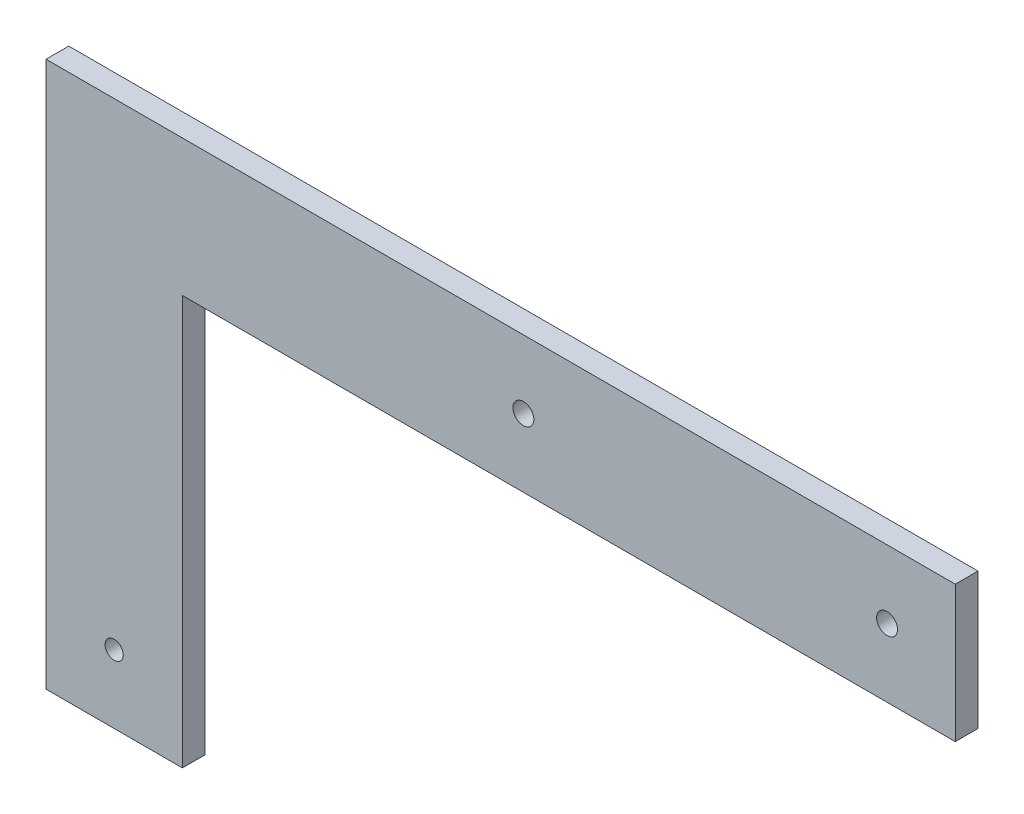
ISO-10303-21;
HEADER;
FILE_DESCRIPTION(('STEP AP214'),'2;1');
FILE_NAME('part.step','',(''),(''),'','','');
FILE_SCHEMA(('AUTOMOTIVE_DESIGN { 1 0 10303 214 1 1 1 1 }'));
ENDSEC;
DATA;
#1=APPLICATION_CONTEXT('core data for automotive mechanical design processes');
#2=APPLICATION_PROTOCOL_DEFINITION('international standard','automotive_design',2000,#1);
#3=PRODUCT_CONTEXT('',#1,'mechanical');
#4=PRODUCT('Part','Part','',(#3));
#5=PRODUCT_RELATED_PRODUCT_CATEGORY('part','',(#4));
#6=PRODUCT_DEFINITION_FORMATION('','',#4);
#7=PRODUCT_DEFINITION_CONTEXT('part definition',#1,'design');
#8=PRODUCT_DEFINITION('design','',#6,#7);
#9=PRODUCT_DEFINITION_SHAPE('','',#8);
#10=(LENGTH_UNIT() NAMED_UNIT(*) SI_UNIT(.MILLI.,.METRE.));
#11=(NAMED_UNIT(*) PLANE_ANGLE_UNIT() SI_UNIT($,.RADIAN.));
#12=(NAMED_UNIT(*) SI_UNIT($,.STERADIAN.) SOLID_ANGLE_UNIT());
#13=UNCERTAINTY_MEASURE_WITH_UNIT(LENGTH_MEASURE(1.E-05),#10,'distance_accuracy_value','');
#14=(GEOMETRIC_REPRESENTATION_CONTEXT(3) GLOBAL_UNCERTAINTY_ASSIGNED_CONTEXT((#13)) GLOBAL_UNIT_ASSIGNED_CONTEXT((#10,
#11,#12)) REPRESENTATION_CONTEXT('',''));
#15=CARTESIAN_POINT('',(0.,0.,0.));
#16=DIRECTION('',(0.,0.,1.));
#17=DIRECTION('',(1.,0.,0.));
#18=AXIS2_PLACEMENT_3D('',#15,#16,#17);
#19=CARTESIAN_POINT('',(19.05,0.,3.175));
#20=DIRECTION('',(0.,1.,0.));
#21=DIRECTION('',(-1.,0.,0.));
#22=AXIS2_PLACEMENT_3D('',#19,#20,#21);
#23=PLANE('',#22);
#24=DIRECTION('',(1.,0.,0.));
#25=VECTOR('',#24,1.);
#26=CARTESIAN_POINT('',(19.05,0.,0.));
#27=LINE('',#26,#25);
#28=CARTESIAN_POINT('',(0.,0.,0.));
#29=VERTEX_POINT('',#28);
#30=CARTESIAN_POINT('',(19.05,0.,0.));
#31=VERTEX_POINT('',#30);
#32=EDGE_CURVE('E133',#29,#31,#27,.T.);
#33=ORIENTED_EDGE('',*,*,#32,.T.);
#34=DIRECTION('',(0.,0.,-1.));
#35=VECTOR('',#34,1.);
#36=CARTESIAN_POINT('',(19.05,0.,3.175));
#37=LINE('',#36,#35);
#38=CARTESIAN_POINT('',(19.05,0.,3.175));
#39=VERTEX_POINT('',#38);
#40=EDGE_CURVE('E11',#39,#31,#37,.T.);
#41=ORIENTED_EDGE('',*,*,#40,.F.);
#42=DIRECTION('',(1.,0.,0.));
#43=VECTOR('',#42,1.);
#44=CARTESIAN_POINT('',(19.05,0.,3.175));
#45=LINE('',#44,#43);
#46=CARTESIAN_POINT('',(0.,0.,3.175));
#47=VERTEX_POINT('',#46);
#48=EDGE_CURVE('E150',#47,#39,#45,.T.);
#49=ORIENTED_EDGE('',*,*,#48,.F.);
#50=DIRECTION('',(0.,0.,-1.));
#51=VECTOR('',#50,1.);
#52=CARTESIAN_POINT('',(0.,0.,3.175));
#53=LINE('',#52,#51);
#54=EDGE_CURVE('E129',#47,#29,#53,.T.);
#55=ORIENTED_EDGE('',*,*,#54,.T.);
#56=EDGE_LOOP('',(#33,#41,#49,#55));
#57=FACE_BOUND('',#56,.T.);
#58=ADVANCED_FACE('F44',(#57),#23,.F.);
#59=CARTESIAN_POINT('',(19.05,57.15,3.175));
#60=DIRECTION('',(-1.,0.,0.));
#61=DIRECTION('',(0.,-1.,0.));
#62=AXIS2_PLACEMENT_3D('',#59,#60,#61);
#63=PLANE('',#62);
#64=DIRECTION('',(0.,1.,0.));
#65=VECTOR('',#64,1.);
#66=CARTESIAN_POINT('',(19.05,57.15,0.));
#67=LINE('',#66,#65);
#68=CARTESIAN_POINT('',(19.05,57.15,0.));
#69=VERTEX_POINT('',#68);
#70=EDGE_CURVE('E137',#31,#69,#67,.T.);
#71=ORIENTED_EDGE('',*,*,#70,.T.);
#72=DIRECTION('',(0.,0.,-1.));
#73=VECTOR('',#72,1.);
#74=CARTESIAN_POINT('',(19.05,57.15,3.175));
#75=LINE('',#74,#73);
#76=CARTESIAN_POINT('',(19.05,57.15,3.175));
#77=VERTEX_POINT('',#76);
#78=EDGE_CURVE('E53',#77,#69,#75,.T.);
#79=ORIENTED_EDGE('',*,*,#78,.F.);
#80=DIRECTION('',(0.,1.,0.));
#81=VECTOR('',#80,1.);
#82=CARTESIAN_POINT('',(19.05,57.15,3.175));
#83=LINE('',#82,#81);
#84=EDGE_CURVE('E98',#39,#77,#83,.T.);
#85=ORIENTED_EDGE('',*,*,#84,.F.);
#86=ORIENTED_EDGE('',*,*,#40,.T.);
#87=EDGE_LOOP('',(#71,#79,#85,#86));
#88=FACE_BOUND('',#87,.T.);
#89=ADVANCED_FACE('F179',(#88),#63,.F.);
#90=CARTESIAN_POINT('',(127.,57.15,3.175));
#91=DIRECTION('',(0.,1.,0.));
#92=DIRECTION('',(-1.,0.,0.));
#93=AXIS2_PLACEMENT_3D('',#90,#91,#92);
#94=PLANE('',#93);
#95=DIRECTION('',(1.,0.,0.));
#96=VECTOR('',#95,1.);
#97=CARTESIAN_POINT('',(127.,57.15,0.));
#98=LINE('',#97,#96);
#99=CARTESIAN_POINT('',(127.,57.15,0.));
#100=VERTEX_POINT('',#99);
#101=EDGE_CURVE('E141',#69,#100,#98,.T.);
#102=ORIENTED_EDGE('',*,*,#101,.T.);
#103=DIRECTION('',(0.,0.,-1.));
#104=VECTOR('',#103,1.);
#105=CARTESIAN_POINT('',(127.,57.15,3.175));
#106=LINE('',#105,#104);
#107=CARTESIAN_POINT('',(127.,57.15,3.175));
#108=VERTEX_POINT('',#107);
#109=EDGE_CURVE('E122',#108,#100,#106,.T.);
#110=ORIENTED_EDGE('',*,*,#109,.F.);
#111=DIRECTION('',(1.,0.,0.));
#112=VECTOR('',#111,1.);
#113=CARTESIAN_POINT('',(127.,57.15,3.175));
#114=LINE('',#113,#112);
#115=EDGE_CURVE('E111',#77,#108,#114,.T.);
#116=ORIENTED_EDGE('',*,*,#115,.F.);
#117=ORIENTED_EDGE('',*,*,#78,.T.);
#118=EDGE_LOOP('',(#102,#110,#116,#117));
#119=FACE_BOUND('',#118,.T.);
#120=ADVANCED_FACE('F160',(#119),#94,.F.);
#121=CARTESIAN_POINT('',(127.,76.2,3.175));
#122=DIRECTION('',(-1.,0.,0.));
#123=DIRECTION('',(0.,0.,1.));
#124=AXIS2_PLACEMENT_3D('',#121,#122,#123);
#125=PLANE('',#124);
#126=DIRECTION('',(0.,1.,0.));
#127=VECTOR('',#126,1.);
#128=CARTESIAN_POINT('',(127.,76.2,0.));
#129=LINE('',#128,#127);
#130=CARTESIAN_POINT('',(127.,76.2,0.));
#131=VERTEX_POINT('',#130);
#132=EDGE_CURVE('E120',#100,#131,#129,.T.);
#133=ORIENTED_EDGE('',*,*,#132,.T.);
#134=DIRECTION('',(0.,0.,-1.));
#135=VECTOR('',#134,1.);
#136=CARTESIAN_POINT('',(127.,76.2,3.175));
#137=LINE('',#136,#135);
#138=CARTESIAN_POINT('',(127.,76.2,3.175));
#139=VERTEX_POINT('',#138);
#140=EDGE_CURVE('E117',#139,#131,#137,.T.);
#141=ORIENTED_EDGE('',*,*,#140,.F.);
#142=DIRECTION('',(0.,1.,0.));
#143=VECTOR('',#142,1.);
#144=CARTESIAN_POINT('',(127.,76.2,3.175));
#145=LINE('',#144,#143);
#146=EDGE_CURVE('E105',#108,#139,#145,.T.);
#147=ORIENTED_EDGE('',*,*,#146,.F.);
#148=ORIENTED_EDGE('',*,*,#109,.T.);
#149=EDGE_LOOP('',(#133,#141,#147,#148));
#150=FACE_BOUND('',#149,.T.);
#151=ADVANCED_FACE('F118',(#150),#125,.F.);
#152=CARTESIAN_POINT('',(0.,76.2,3.175));
#153=DIRECTION('',(0.,-1.,0.));
#154=DIRECTION('',(0.,0.,-1.));
#155=AXIS2_PLACEMENT_3D('',#152,#153,#154);
#156=PLANE('',#155);
#157=DIRECTION('',(-1.,0.,0.));
#158=VECTOR('',#157,1.);
#159=CARTESIAN_POINT('',(0.,76.2,0.));
#160=LINE('',#159,#158);
#161=CARTESIAN_POINT('',(0.,76.2,0.));
#162=VERTEX_POINT('',#161);
#163=EDGE_CURVE('E84',#131,#162,#160,.T.);
#164=ORIENTED_EDGE('',*,*,#163,.T.);
#165=DIRECTION('',(0.,0.,-1.));
#166=VECTOR('',#165,1.);
#167=CARTESIAN_POINT('',(0.,76.2,3.175));
#168=LINE('',#167,#166);
#169=CARTESIAN_POINT('',(0.,76.2,3.175));
#170=VERTEX_POINT('',#169);
#171=EDGE_CURVE('E123',#170,#162,#168,.T.);
#172=ORIENTED_EDGE('',*,*,#171,.F.);
#173=DIRECTION('',(-1.,0.,0.));
#174=VECTOR('',#173,1.);
#175=CARTESIAN_POINT('',(0.,76.2,3.175));
#176=LINE('',#175,#174);
#177=EDGE_CURVE('E109',#139,#170,#176,.T.);
#178=ORIENTED_EDGE('',*,*,#177,.F.);
#179=ORIENTED_EDGE('',*,*,#140,.T.);
#180=EDGE_LOOP('',(#164,#172,#178,#179));
#181=FACE_BOUND('',#180,.T.);
#182=ADVANCED_FACE('F125',(#181),#156,.F.);
#183=CARTESIAN_POINT('',(0.,0.,3.175));
#184=DIRECTION('',(1.,0.,0.));
#185=DIRECTION('',(0.,0.,-1.));
#186=AXIS2_PLACEMENT_3D('',#183,#184,#185);
#187=PLANE('',#186);
#188=DIRECTION('',(0.,-1.,0.));
#189=VECTOR('',#188,1.);
#190=CARTESIAN_POINT('',(0.,0.,0.));
#191=LINE('',#190,#189);
#192=EDGE_CURVE('E90',#162,#29,#191,.T.);
#193=ORIENTED_EDGE('',*,*,#192,.T.);
#194=ORIENTED_EDGE('',*,*,#54,.F.);
#195=DIRECTION('',(0.,-1.,0.));
#196=VECTOR('',#195,1.);
#197=CARTESIAN_POINT('',(0.,0.,3.175));
#198=LINE('',#197,#196);
#199=EDGE_CURVE('E61',#170,#47,#198,.T.);
#200=ORIENTED_EDGE('',*,*,#199,.F.);
#201=ORIENTED_EDGE('',*,*,#171,.T.);
#202=EDGE_LOOP('',(#193,#194,#200,#201));
#203=FACE_BOUND('',#202,.T.);
#204=ADVANCED_FACE('F167',(#203),#187,.F.);
#205=CARTESIAN_POINT('',(0.,0.,3.175));
#206=DIRECTION('',(0.,0.,-1.));
#207=DIRECTION('',(-1.,0.,0.));
#208=AXIS2_PLACEMENT_3D('',#205,#206,#207);
#209=PLANE('',#208);
#210=CARTESIAN_POINT('',(9.525,9.525,3.175));
#211=DIRECTION('',(0.,0.,1.));
#212=DIRECTION('',(1.,0.,0.));
#213=AXIS2_PLACEMENT_3D('',#210,#211,#212);
#214=CIRCLE('',#213,1.27);
#215=CARTESIAN_POINT('',(10.795,9.525,3.175));
#216=VERTEX_POINT('',#215);
#217=EDGE_CURVE('E290',#216,#216,#214,.T.);
#218=ORIENTED_EDGE('',*,*,#217,.F.);
#219=EDGE_LOOP('',(#218));
#220=FACE_BOUND('',#219,.T.);
#221=CARTESIAN_POINT('',(117.475,66.675,3.175));
#222=DIRECTION('',(0.,0.,1.));
#223=DIRECTION('',(1.,0.,0.));
#224=AXIS2_PLACEMENT_3D('',#221,#222,#223);
#225=CIRCLE('',#224,1.4605);
#226=CARTESIAN_POINT('',(118.9355,66.675,3.175));
#227=VERTEX_POINT('',#226);
#228=EDGE_CURVE('E292',#227,#227,#225,.T.);
#229=ORIENTED_EDGE('',*,*,#228,.F.);
#230=EDGE_LOOP('',(#229));
#231=FACE_BOUND('',#230,.T.);
#232=CARTESIAN_POINT('',(66.675,66.675,3.175));
#233=DIRECTION('',(0.,0.,1.));
#234=DIRECTION('',(1.,0.,0.));
#235=AXIS2_PLACEMENT_3D('',#232,#233,#234);
#236=CIRCLE('',#235,1.4605);
#237=CARTESIAN_POINT('',(68.1355,66.675,3.175));
#238=VERTEX_POINT('',#237);
#239=EDGE_CURVE('E304',#238,#238,#236,.T.);
#240=ORIENTED_EDGE('',*,*,#239,.F.);
#241=EDGE_LOOP('',(#240));
#242=FACE_BOUND('',#241,.T.);
#243=ORIENTED_EDGE('',*,*,#48,.T.);
#244=ORIENTED_EDGE('',*,*,#84,.T.);
#245=ORIENTED_EDGE('',*,*,#115,.T.);
#246=ORIENTED_EDGE('',*,*,#146,.T.);
#247=ORIENTED_EDGE('',*,*,#177,.T.);
#248=ORIENTED_EDGE('',*,*,#199,.T.);
#249=EDGE_LOOP('',(#243,#244,#245,#246,#247,#248));
#250=FACE_BOUND('',#249,.T.);
#251=ADVANCED_FACE('F107',(#220,#231,#242,#250),#209,.F.);
#252=CARTESIAN_POINT('',(0.,0.,0.));
#253=DIRECTION('',(0.,0.,-1.));
#254=DIRECTION('',(-1.,0.,0.));
#255=AXIS2_PLACEMENT_3D('',#252,#253,#254);
#256=PLANE('',#255);
#257=CARTESIAN_POINT('',(9.525,9.525,0.));
#258=DIRECTION('',(0.,0.,1.));
#259=DIRECTION('',(1.,0.,0.));
#260=AXIS2_PLACEMENT_3D('',#257,#258,#259);
#261=CIRCLE('',#260,1.27);
#262=CARTESIAN_POINT('',(10.795,9.525,0.));
#263=VERTEX_POINT('',#262);
#264=EDGE_CURVE('E138',#263,#263,#261,.T.);
#265=ORIENTED_EDGE('',*,*,#264,.T.);
#266=EDGE_LOOP('',(#265));
#267=FACE_BOUND('',#266,.T.);
#268=CARTESIAN_POINT('',(117.475,66.675,0.));
#269=DIRECTION('',(0.,0.,1.));
#270=DIRECTION('',(1.,0.,0.));
#271=AXIS2_PLACEMENT_3D('',#268,#269,#270);
#272=CIRCLE('',#271,1.4605);
#273=CARTESIAN_POINT('',(118.9355,66.675,0.));
#274=VERTEX_POINT('',#273);
#275=EDGE_CURVE('E298',#274,#274,#272,.T.);
#276=ORIENTED_EDGE('',*,*,#275,.T.);
#277=EDGE_LOOP('',(#276));
#278=FACE_BOUND('',#277,.T.);
#279=CARTESIAN_POINT('',(66.675,66.675,0.));
#280=DIRECTION('',(0.,0.,1.));
#281=DIRECTION('',(1.,0.,0.));
#282=AXIS2_PLACEMENT_3D('',#279,#280,#281);
#283=CIRCLE('',#282,1.4605);
#284=CARTESIAN_POINT('',(68.1355,66.675,0.));
#285=VERTEX_POINT('',#284);
#286=EDGE_CURVE('E308',#285,#285,#283,.T.);
#287=ORIENTED_EDGE('',*,*,#286,.T.);
#288=EDGE_LOOP('',(#287));
#289=FACE_BOUND('',#288,.T.);
#290=ORIENTED_EDGE('',*,*,#32,.F.);
#291=ORIENTED_EDGE('',*,*,#192,.F.);
#292=ORIENTED_EDGE('',*,*,#163,.F.);
#293=ORIENTED_EDGE('',*,*,#132,.F.);
#294=ORIENTED_EDGE('',*,*,#101,.F.);
#295=ORIENTED_EDGE('',*,*,#70,.F.);
#296=EDGE_LOOP('',(#290,#291,#292,#293,#294,#295));
#297=FACE_BOUND('',#296,.T.);
#298=ADVANCED_FACE('F163',(#267,#278,#289,#297),#256,.T.);
#299=CARTESIAN_POINT('',(66.675,66.675,0.));
#300=DIRECTION('',(0.,0.,1.));
#301=DIRECTION('',(1.,0.,0.));
#302=AXIS2_PLACEMENT_3D('',#299,#300,#301);
#303=CYLINDRICAL_SURFACE('',#302,1.4605);
#304=ORIENTED_EDGE('',*,*,#286,.F.);
#305=EDGE_LOOP('',(#304));
#306=FACE_BOUND('',#305,.T.);
#307=ORIENTED_EDGE('',*,*,#239,.T.);
#308=EDGE_LOOP('',(#307));
#309=FACE_BOUND('',#308,.T.);
#310=ADVANCED_FACE('F219',(#306,#309),#303,.F.);
#311=CARTESIAN_POINT('',(117.475,66.675,0.));
#312=DIRECTION('',(0.,0.,1.));
#313=DIRECTION('',(1.,0.,0.));
#314=AXIS2_PLACEMENT_3D('',#311,#312,#313);
#315=CYLINDRICAL_SURFACE('',#314,1.4605);
#316=ORIENTED_EDGE('',*,*,#275,.F.);
#317=EDGE_LOOP('',(#316));
#318=FACE_BOUND('',#317,.T.);
#319=ORIENTED_EDGE('',*,*,#228,.T.);
#320=EDGE_LOOP('',(#319));
#321=FACE_BOUND('',#320,.T.);
#322=ADVANCED_FACE('F229',(#318,#321),#315,.F.);
#323=CARTESIAN_POINT('',(9.525,9.525,0.));
#324=DIRECTION('',(0.,0.,1.));
#325=DIRECTION('',(1.,0.,0.));
#326=AXIS2_PLACEMENT_3D('',#323,#324,#325);
#327=CYLINDRICAL_SURFACE('',#326,1.27);
#328=ORIENTED_EDGE('',*,*,#264,.F.);
#329=EDGE_LOOP('',(#328));
#330=FACE_BOUND('',#329,.T.);
#331=ORIENTED_EDGE('',*,*,#217,.T.);
#332=EDGE_LOOP('',(#331));
#333=FACE_BOUND('',#332,.T.);
#334=ADVANCED_FACE('F240',(#330,#333),#327,.F.);
#335=CLOSED_SHELL('',(#58,#89,#120,#151,#182,#204,#251,#298,#310,#322,#334));
#336=MANIFOLD_SOLID_BREP('B2',#335);
#337=ADVANCED_BREP_SHAPE_REPRESENTATION('',(#18,#336),#14);
#338=SHAPE_DEFINITION_REPRESENTATION(#9,#337);
ENDSEC;
END-ISO-10303-21;
